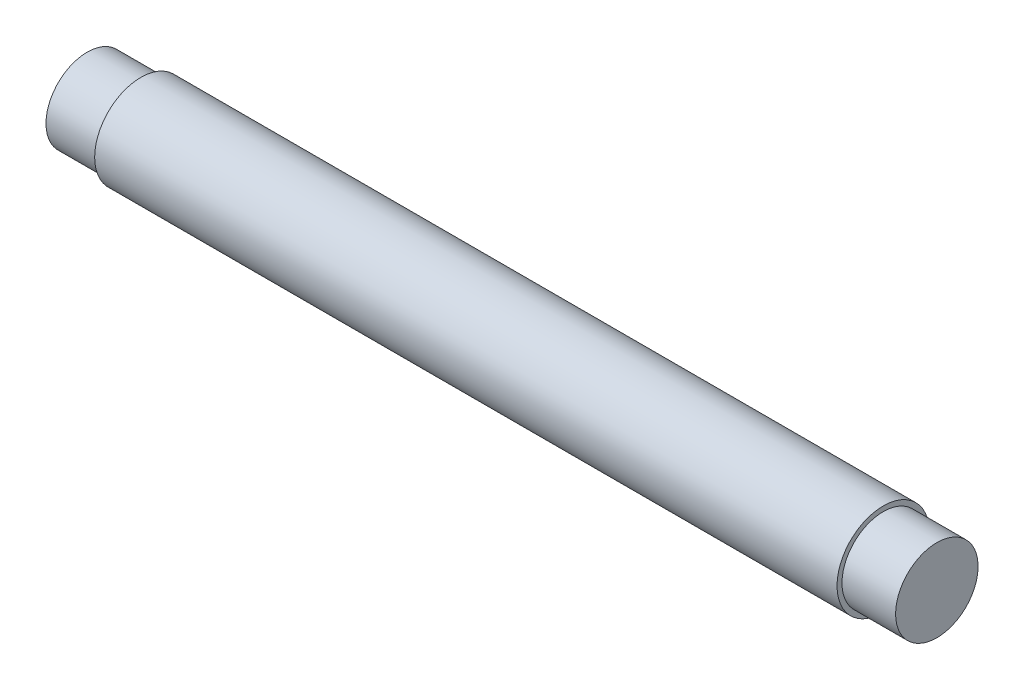
ISO-10303-21;
HEADER;
FILE_DESCRIPTION(('STEP AP214'),'2;1');
FILE_NAME('part.step','',(''),(''),'','','');
FILE_SCHEMA(('AUTOMOTIVE_DESIGN { 1 0 10303 214 1 1 1 1 }'));
ENDSEC;
DATA;
#1=APPLICATION_CONTEXT('core data for automotive mechanical design processes');
#2=APPLICATION_PROTOCOL_DEFINITION('international standard','automotive_design',2000,#1);
#3=PRODUCT_CONTEXT('',#1,'mechanical');
#4=PRODUCT('Part','Part','',(#3));
#5=PRODUCT_RELATED_PRODUCT_CATEGORY('part','',(#4));
#6=PRODUCT_DEFINITION_FORMATION('','',#4);
#7=PRODUCT_DEFINITION_CONTEXT('part definition',#1,'design');
#8=PRODUCT_DEFINITION('design','',#6,#7);
#9=PRODUCT_DEFINITION_SHAPE('','',#8);
#10=(LENGTH_UNIT() NAMED_UNIT(*) SI_UNIT(.MILLI.,.METRE.));
#11=(NAMED_UNIT(*) PLANE_ANGLE_UNIT() SI_UNIT($,.RADIAN.));
#12=(NAMED_UNIT(*) SI_UNIT($,.STERADIAN.) SOLID_ANGLE_UNIT());
#13=UNCERTAINTY_MEASURE_WITH_UNIT(LENGTH_MEASURE(1.E-05),#10,'distance_accuracy_value','');
#14=(GEOMETRIC_REPRESENTATION_CONTEXT(3) GLOBAL_UNCERTAINTY_ASSIGNED_CONTEXT((#13)) GLOBAL_UNIT_ASSIGNED_CONTEXT((#10,
#11,#12)) REPRESENTATION_CONTEXT('',''));
#15=CARTESIAN_POINT('',(0.,0.,0.));
#16=DIRECTION('',(0.,0.,1.));
#17=DIRECTION('',(1.,0.,0.));
#18=AXIS2_PLACEMENT_3D('',#15,#16,#17);
#19=CARTESIAN_POINT('',(57.15,6.35000000000002,0.));
#20=DIRECTION('',(-1.,0.,0.));
#21=DIRECTION('',(0.,0.,1.));
#22=AXIS2_PLACEMENT_3D('',#19,#20,#21);
#23=PLANE('',#22);
#24=CARTESIAN_POINT('',(57.15,0.,0.));
#25=DIRECTION('',(-1.,0.,0.));
#26=DIRECTION('',(0.,0.,1.));
#27=AXIS2_PLACEMENT_3D('',#24,#25,#26);
#28=CIRCLE('',#27,7.112);
#29=CARTESIAN_POINT('',(57.15,0.,7.112));
#30=VERTEX_POINT('',#29);
#31=EDGE_CURVE('E10',#30,#30,#28,.T.);
#32=ORIENTED_EDGE('',*,*,#31,.F.);
#33=EDGE_LOOP('',(#32));
#34=FACE_BOUND('',#33,.T.);
#35=CARTESIAN_POINT('',(57.15,0.,0.));
#36=DIRECTION('',(-1.,0.,0.));
#37=DIRECTION('',(0.,0.,1.));
#38=AXIS2_PLACEMENT_3D('',#35,#36,#37);
#39=CIRCLE('',#38,6.35000000000002);
#40=CARTESIAN_POINT('',(57.15,0.,6.35000000000002));
#41=VERTEX_POINT('',#40);
#42=EDGE_CURVE('E68',#41,#41,#39,.T.);
#43=ORIENTED_EDGE('',*,*,#42,.T.);
#44=EDGE_LOOP('',(#43));
#45=FACE_BOUND('',#44,.T.);
#46=ADVANCED_FACE('F41',(#34,#45),#23,.F.);
#47=CARTESIAN_POINT('',(0.,0.,0.));
#48=DIRECTION('',(-1.,0.,0.));
#49=DIRECTION('',(0.,0.,1.));
#50=AXIS2_PLACEMENT_3D('',#47,#48,#49);
#51=CYLINDRICAL_SURFACE('',#50,7.11199999999999);
#52=CARTESIAN_POINT('',(-57.15,0.,0.));
#53=DIRECTION('',(-1.,0.,0.));
#54=DIRECTION('',(0.,0.,1.));
#55=AXIS2_PLACEMENT_3D('',#52,#53,#54);
#56=CIRCLE('',#55,7.11199999999999);
#57=CARTESIAN_POINT('',(-57.15,0.,7.11199999999999));
#58=VERTEX_POINT('',#57);
#59=EDGE_CURVE('E48',#58,#58,#56,.T.);
#60=ORIENTED_EDGE('',*,*,#59,.F.);
#61=EDGE_LOOP('',(#60));
#62=FACE_BOUND('',#61,.T.);
#63=ORIENTED_EDGE('',*,*,#31,.T.);
#64=EDGE_LOOP('',(#63));
#65=FACE_BOUND('',#64,.T.);
#66=ADVANCED_FACE('F91',(#62,#65),#51,.T.);
#67=CARTESIAN_POINT('',(-57.15,7.11199999999999,0.));
#68=DIRECTION('',(1.,0.,0.));
#69=DIRECTION('',(0.,0.,-1.));
#70=AXIS2_PLACEMENT_3D('',#67,#68,#69);
#71=PLANE('',#70);
#72=CARTESIAN_POINT('',(-57.15,0.,0.));
#73=DIRECTION('',(-1.,0.,0.));
#74=DIRECTION('',(0.,0.,1.));
#75=AXIS2_PLACEMENT_3D('',#72,#73,#74);
#76=CIRCLE('',#75,6.35000000000001);
#77=CARTESIAN_POINT('',(-57.15,0.,6.35000000000001));
#78=VERTEX_POINT('',#77);
#79=EDGE_CURVE('E53',#78,#78,#76,.T.);
#80=ORIENTED_EDGE('',*,*,#79,.F.);
#81=EDGE_LOOP('',(#80));
#82=FACE_BOUND('',#81,.T.);
#83=ORIENTED_EDGE('',*,*,#59,.T.);
#84=EDGE_LOOP('',(#83));
#85=FACE_BOUND('',#84,.T.);
#86=ADVANCED_FACE('F96',(#82,#85),#71,.F.);
#87=CARTESIAN_POINT('',(0.,0.,0.));
#88=DIRECTION('',(-1.,0.,0.));
#89=DIRECTION('',(0.,0.,1.));
#90=AXIS2_PLACEMENT_3D('',#87,#88,#89);
#91=CYLINDRICAL_SURFACE('',#90,6.35000000000001);
#92=CARTESIAN_POINT('',(-65.405,0.,0.));
#93=DIRECTION('',(-1.,0.,0.));
#94=DIRECTION('',(0.,0.,1.));
#95=AXIS2_PLACEMENT_3D('',#92,#93,#94);
#96=CIRCLE('',#95,6.35000000000001);
#97=CARTESIAN_POINT('',(-65.405,0.,6.35000000000001));
#98=VERTEX_POINT('',#97);
#99=EDGE_CURVE('E58',#98,#98,#96,.T.);
#100=ORIENTED_EDGE('',*,*,#99,.F.);
#101=EDGE_LOOP('',(#100));
#102=FACE_BOUND('',#101,.T.);
#103=ORIENTED_EDGE('',*,*,#79,.T.);
#104=EDGE_LOOP('',(#103));
#105=FACE_BOUND('',#104,.T.);
#106=ADVANCED_FACE('F87',(#102,#105),#91,.T.);
#107=CARTESIAN_POINT('',(-65.405,6.35000000000001,0.));
#108=DIRECTION('',(1.,0.,0.));
#109=DIRECTION('',(0.,0.,-1.));
#110=AXIS2_PLACEMENT_3D('',#107,#108,#109);
#111=PLANE('',#110);
#112=ORIENTED_EDGE('',*,*,#99,.T.);
#113=EDGE_LOOP('',(#112));
#114=FACE_BOUND('',#113,.T.);
#115=ADVANCED_FACE('F82',(#114),#111,.F.);
#116=CARTESIAN_POINT('',(65.405,0.,0.));
#117=DIRECTION('',(-1.,0.,0.));
#118=DIRECTION('',(0.,0.,1.));
#119=AXIS2_PLACEMENT_3D('',#116,#117,#118);
#120=PLANE('',#119);
#121=CARTESIAN_POINT('',(65.405,0.,0.));
#122=DIRECTION('',(-1.,0.,0.));
#123=DIRECTION('',(0.,0.,1.));
#124=AXIS2_PLACEMENT_3D('',#121,#122,#123);
#125=CIRCLE('',#124,6.35000000000002);
#126=CARTESIAN_POINT('',(65.405,0.,6.35000000000002));
#127=VERTEX_POINT('',#126);
#128=EDGE_CURVE('E64',#127,#127,#125,.T.);
#129=ORIENTED_EDGE('',*,*,#128,.F.);
#130=EDGE_LOOP('',(#129));
#131=FACE_BOUND('',#130,.T.);
#132=ADVANCED_FACE('F77',(#131),#120,.F.);
#133=CARTESIAN_POINT('',(0.,0.,0.));
#134=DIRECTION('',(-1.,0.,0.));
#135=DIRECTION('',(0.,0.,1.));
#136=AXIS2_PLACEMENT_3D('',#133,#134,#135);
#137=CYLINDRICAL_SURFACE('',#136,6.35000000000002);
#138=ORIENTED_EDGE('',*,*,#42,.F.);
#139=EDGE_LOOP('',(#138));
#140=FACE_BOUND('',#139,.T.);
#141=ORIENTED_EDGE('',*,*,#128,.T.);
#142=EDGE_LOOP('',(#141));
#143=FACE_BOUND('',#142,.T.);
#144=ADVANCED_FACE('F74',(#140,#143),#137,.T.);
#145=CLOSED_SHELL('',(#46,#66,#86,#106,#115,#132,#144));
#146=MANIFOLD_SOLID_BREP('B2',#145);
#147=ADVANCED_BREP_SHAPE_REPRESENTATION('',(#18,#146),#14);
#148=SHAPE_DEFINITION_REPRESENTATION(#9,#147);
ENDSEC;
END-ISO-10303-21;
